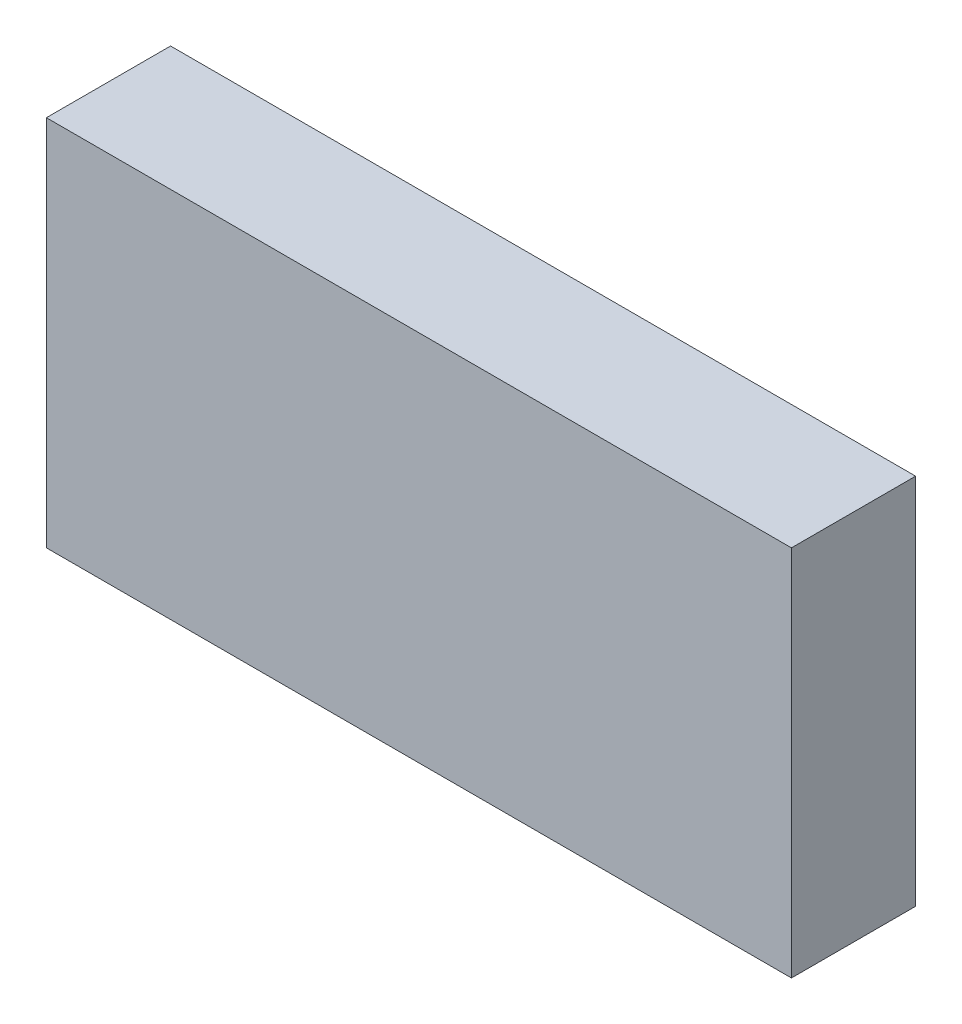
ISO-10303-21;
HEADER;
FILE_DESCRIPTION(('STEP AP214'),'2;1');
FILE_NAME('part.step','',(''),(''),'','','');
FILE_SCHEMA(('AUTOMOTIVE_DESIGN { 1 0 10303 214 1 1 1 1 }'));
ENDSEC;
DATA;
#1=APPLICATION_CONTEXT('core data for automotive mechanical design processes');
#2=APPLICATION_PROTOCOL_DEFINITION('international standard','automotive_design',2000,#1);
#3=PRODUCT_CONTEXT('',#1,'mechanical');
#4=PRODUCT('Part','Part','',(#3));
#5=PRODUCT_RELATED_PRODUCT_CATEGORY('part','',(#4));
#6=PRODUCT_DEFINITION_FORMATION('','',#4);
#7=PRODUCT_DEFINITION_CONTEXT('part definition',#1,'design');
#8=PRODUCT_DEFINITION('design','',#6,#7);
#9=PRODUCT_DEFINITION_SHAPE('','',#8);
#10=(LENGTH_UNIT() NAMED_UNIT(*) SI_UNIT(.MILLI.,.METRE.));
#11=(NAMED_UNIT(*) PLANE_ANGLE_UNIT() SI_UNIT($,.RADIAN.));
#12=(NAMED_UNIT(*) SI_UNIT($,.STERADIAN.) SOLID_ANGLE_UNIT());
#13=UNCERTAINTY_MEASURE_WITH_UNIT(LENGTH_MEASURE(1.E-05),#10,'distance_accuracy_value','');
#14=(GEOMETRIC_REPRESENTATION_CONTEXT(3) GLOBAL_UNCERTAINTY_ASSIGNED_CONTEXT((#13)) GLOBAL_UNIT_ASSIGNED_CONTEXT((#10,
#11,#12)) REPRESENTATION_CONTEXT('',''));
#15=CARTESIAN_POINT('',(0.,0.,0.));
#16=DIRECTION('',(0.,0.,1.));
#17=DIRECTION('',(1.,0.,0.));
#18=AXIS2_PLACEMENT_3D('',#15,#16,#17);
#19=CARTESIAN_POINT('',(9.525,4.7625,3.175));
#20=DIRECTION('',(-1.,0.,0.));
#21=DIRECTION('',(0.,-1.,0.));
#22=AXIS2_PLACEMENT_3D('',#19,#20,#21);
#23=PLANE('',#22);
#24=DIRECTION('',(0.,1.,0.));
#25=VECTOR('',#24,1.);
#26=CARTESIAN_POINT('',(9.525,4.7625,0.));
#27=LINE('',#26,#25);
#28=CARTESIAN_POINT('',(9.525,-4.7625,0.));
#29=VERTEX_POINT('',#28);
#30=CARTESIAN_POINT('',(9.525,4.7625,0.));
#31=VERTEX_POINT('',#30);
#32=EDGE_CURVE('E98',#29,#31,#27,.T.);
#33=ORIENTED_EDGE('',*,*,#32,.T.);
#34=DIRECTION('',(0.,0.,-1.));
#35=VECTOR('',#34,1.);
#36=CARTESIAN_POINT('',(9.525,4.7625,3.175));
#37=LINE('',#36,#35);
#38=CARTESIAN_POINT('',(9.525,4.7625,3.175));
#39=VERTEX_POINT('',#38);
#40=EDGE_CURVE('E11',#39,#31,#37,.T.);
#41=ORIENTED_EDGE('',*,*,#40,.F.);
#42=DIRECTION('',(0.,1.,0.));
#43=VECTOR('',#42,1.);
#44=CARTESIAN_POINT('',(9.525,4.7625,3.175));
#45=LINE('',#44,#43);
#46=CARTESIAN_POINT('',(9.525,-4.7625,3.175));
#47=VERTEX_POINT('',#46);
#48=EDGE_CURVE('E86',#47,#39,#45,.T.);
#49=ORIENTED_EDGE('',*,*,#48,.F.);
#50=DIRECTION('',(0.,0.,-1.));
#51=VECTOR('',#50,1.);
#52=CARTESIAN_POINT('',(9.525,-4.7625,3.175));
#53=LINE('',#52,#51);
#54=EDGE_CURVE('E94',#47,#29,#53,.T.);
#55=ORIENTED_EDGE('',*,*,#54,.T.);
#56=EDGE_LOOP('',(#33,#41,#49,#55));
#57=FACE_BOUND('',#56,.T.);
#58=ADVANCED_FACE('F35',(#57),#23,.F.);
#59=CARTESIAN_POINT('',(-9.525,4.7625,3.175));
#60=DIRECTION('',(0.,-1.,0.));
#61=DIRECTION('',(0.,0.,-1.));
#62=AXIS2_PLACEMENT_3D('',#59,#60,#61);
#63=PLANE('',#62);
#64=DIRECTION('',(-1.,0.,0.));
#65=VECTOR('',#64,1.);
#66=CARTESIAN_POINT('',(-9.525,4.7625,0.));
#67=LINE('',#66,#65);
#68=CARTESIAN_POINT('',(-9.525,4.7625,0.));
#69=VERTEX_POINT('',#68);
#70=EDGE_CURVE('E90',#31,#69,#67,.T.);
#71=ORIENTED_EDGE('',*,*,#70,.T.);
#72=DIRECTION('',(0.,0.,-1.));
#73=VECTOR('',#72,1.);
#74=CARTESIAN_POINT('',(-9.525,4.7625,3.175));
#75=LINE('',#74,#73);
#76=CARTESIAN_POINT('',(-9.525,4.7625,3.175));
#77=VERTEX_POINT('',#76);
#78=EDGE_CURVE('E43',#77,#69,#75,.T.);
#79=ORIENTED_EDGE('',*,*,#78,.F.);
#80=DIRECTION('',(-1.,0.,0.));
#81=VECTOR('',#80,1.);
#82=CARTESIAN_POINT('',(-9.525,4.7625,3.175));
#83=LINE('',#82,#81);
#84=EDGE_CURVE('E81',#39,#77,#83,.T.);
#85=ORIENTED_EDGE('',*,*,#84,.F.);
#86=ORIENTED_EDGE('',*,*,#40,.T.);
#87=EDGE_LOOP('',(#71,#79,#85,#86));
#88=FACE_BOUND('',#87,.T.);
#89=ADVANCED_FACE('F89',(#88),#63,.F.);
#90=CARTESIAN_POINT('',(-9.525,4.7625,3.175));
#91=DIRECTION('',(1.,0.,0.));
#92=DIRECTION('',(0.,1.,0.));
#93=AXIS2_PLACEMENT_3D('',#90,#91,#92);
#94=PLANE('',#93);
#95=DIRECTION('',(0.,-1.,0.));
#96=VECTOR('',#95,1.);
#97=CARTESIAN_POINT('',(-9.525,4.7625,0.));
#98=LINE('',#97,#96);
#99=CARTESIAN_POINT('',(-9.525,-4.7625,0.));
#100=VERTEX_POINT('',#99);
#101=EDGE_CURVE('E68',#69,#100,#98,.T.);
#102=ORIENTED_EDGE('',*,*,#101,.T.);
#103=DIRECTION('',(0.,0.,-1.));
#104=VECTOR('',#103,1.);
#105=CARTESIAN_POINT('',(-9.525,-4.7625,3.175));
#106=LINE('',#105,#104);
#107=CARTESIAN_POINT('',(-9.525,-4.7625,3.175));
#108=VERTEX_POINT('',#107);
#109=EDGE_CURVE('E91',#108,#100,#106,.T.);
#110=ORIENTED_EDGE('',*,*,#109,.F.);
#111=DIRECTION('',(0.,-1.,0.));
#112=VECTOR('',#111,1.);
#113=CARTESIAN_POINT('',(-9.525,4.7625,3.175));
#114=LINE('',#113,#112);
#115=EDGE_CURVE('E84',#77,#108,#114,.T.);
#116=ORIENTED_EDGE('',*,*,#115,.F.);
#117=ORIENTED_EDGE('',*,*,#78,.T.);
#118=EDGE_LOOP('',(#102,#110,#116,#117));
#119=FACE_BOUND('',#118,.T.);
#120=ADVANCED_FACE('F92',(#119),#94,.F.);
#121=CARTESIAN_POINT('',(-9.525,-4.7625,3.175));
#122=DIRECTION('',(0.,1.,0.));
#123=DIRECTION('',(0.,0.,1.));
#124=AXIS2_PLACEMENT_3D('',#121,#122,#123);
#125=PLANE('',#124);
#126=DIRECTION('',(1.,0.,0.));
#127=VECTOR('',#126,1.);
#128=CARTESIAN_POINT('',(-9.525,-4.7625,0.));
#129=LINE('',#128,#127);
#130=EDGE_CURVE('E74',#100,#29,#129,.T.);
#131=ORIENTED_EDGE('',*,*,#130,.T.);
#132=ORIENTED_EDGE('',*,*,#54,.F.);
#133=DIRECTION('',(1.,0.,0.));
#134=VECTOR('',#133,1.);
#135=CARTESIAN_POINT('',(-9.525,-4.7625,3.175));
#136=LINE('',#135,#134);
#137=EDGE_CURVE('E51',#108,#47,#136,.T.);
#138=ORIENTED_EDGE('',*,*,#137,.F.);
#139=ORIENTED_EDGE('',*,*,#109,.T.);
#140=EDGE_LOOP('',(#131,#132,#138,#139));
#141=FACE_BOUND('',#140,.T.);
#142=ADVANCED_FACE('F105',(#141),#125,.F.);
#143=CARTESIAN_POINT('',(0.,0.,3.175));
#144=DIRECTION('',(0.,0.,1.));
#145=DIRECTION('',(1.,0.,0.));
#146=AXIS2_PLACEMENT_3D('',#143,#144,#145);
#147=PLANE('',#146);
#148=ORIENTED_EDGE('',*,*,#48,.T.);
#149=ORIENTED_EDGE('',*,*,#84,.T.);
#150=ORIENTED_EDGE('',*,*,#115,.T.);
#151=ORIENTED_EDGE('',*,*,#137,.T.);
#152=EDGE_LOOP('',(#148,#149,#150,#151));
#153=FACE_BOUND('',#152,.T.);
#154=ADVANCED_FACE('F82',(#153),#147,.T.);
#155=CARTESIAN_POINT('',(0.,0.,0.));
#156=DIRECTION('',(0.,0.,1.));
#157=DIRECTION('',(1.,0.,0.));
#158=AXIS2_PLACEMENT_3D('',#155,#156,#157);
#159=PLANE('',#158);
#160=ORIENTED_EDGE('',*,*,#32,.F.);
#161=ORIENTED_EDGE('',*,*,#130,.F.);
#162=ORIENTED_EDGE('',*,*,#101,.F.);
#163=ORIENTED_EDGE('',*,*,#70,.F.);
#164=EDGE_LOOP('',(#160,#161,#162,#163));
#165=FACE_BOUND('',#164,.T.);
#166=ADVANCED_FACE('F108',(#165),#159,.F.);
#167=CLOSED_SHELL('',(#58,#89,#120,#142,#154,#166));
#168=MANIFOLD_SOLID_BREP('B2',#167);
#169=ADVANCED_BREP_SHAPE_REPRESENTATION('',(#18,#168),#14);
#170=SHAPE_DEFINITION_REPRESENTATION(#9,#169);
ENDSEC;
END-ISO-10303-21;
